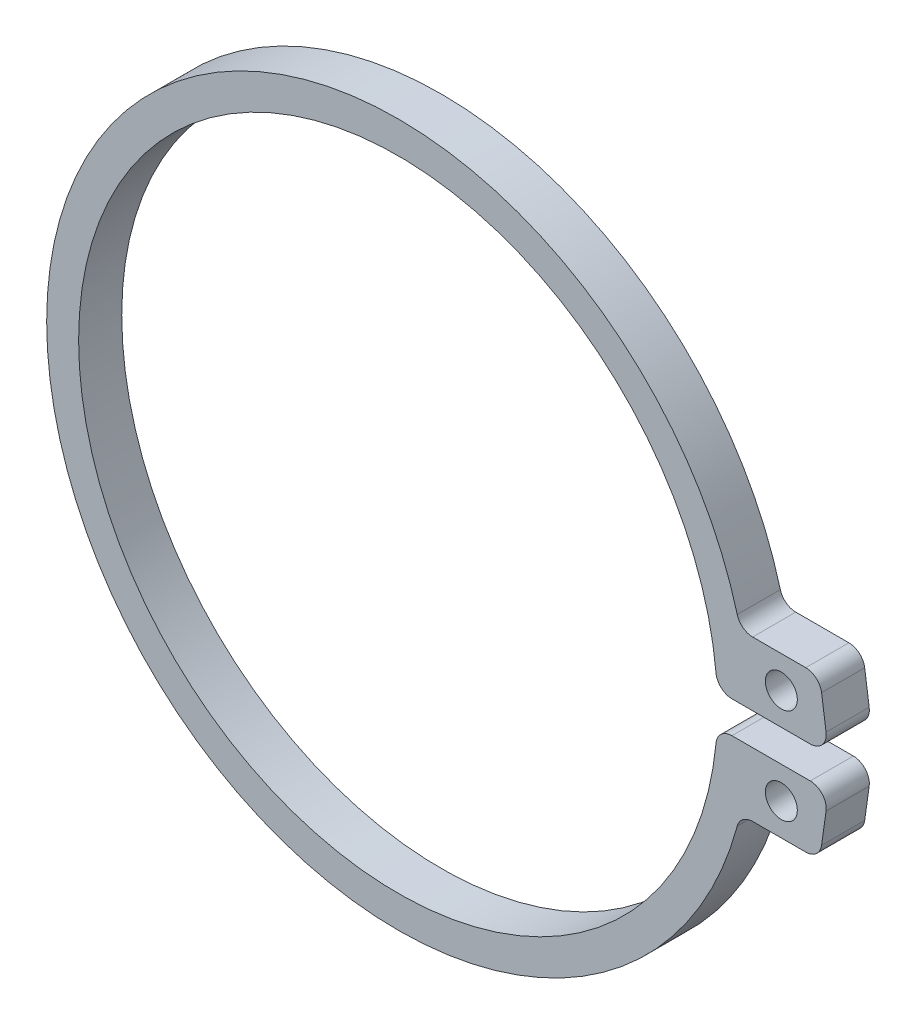
ISO-10303-21;
HEADER;
FILE_DESCRIPTION(('STEP AP214'),'2;1');
FILE_NAME('part.step','',(''),(''),'','','');
FILE_SCHEMA(('AUTOMOTIVE_DESIGN { 1 0 10303 214 1 1 1 1 }'));
ENDSEC;
DATA;
#1=APPLICATION_CONTEXT('core data for automotive mechanical design processes');
#2=APPLICATION_PROTOCOL_DEFINITION('international standard','automotive_design',2000,#1);
#3=PRODUCT_CONTEXT('',#1,'mechanical');
#4=PRODUCT('Part','Part','',(#3));
#5=PRODUCT_RELATED_PRODUCT_CATEGORY('part','',(#4));
#6=PRODUCT_DEFINITION_FORMATION('','',#4);
#7=PRODUCT_DEFINITION_CONTEXT('part definition',#1,'design');
#8=PRODUCT_DEFINITION('design','',#6,#7);
#9=PRODUCT_DEFINITION_SHAPE('','',#8);
#10=(LENGTH_UNIT() NAMED_UNIT(*) SI_UNIT(.MILLI.,.METRE.));
#11=(NAMED_UNIT(*) PLANE_ANGLE_UNIT() SI_UNIT($,.RADIAN.));
#12=(NAMED_UNIT(*) SI_UNIT($,.STERADIAN.) SOLID_ANGLE_UNIT());
#13=UNCERTAINTY_MEASURE_WITH_UNIT(LENGTH_MEASURE(1.E-05),#10,'distance_accuracy_value','');
#14=(GEOMETRIC_REPRESENTATION_CONTEXT(3) GLOBAL_UNCERTAINTY_ASSIGNED_CONTEXT((#13)) GLOBAL_UNIT_ASSIGNED_CONTEXT((#10,
#11,#12)) REPRESENTATION_CONTEXT('',''));
#15=CARTESIAN_POINT('',(0.,0.,0.));
#16=DIRECTION('',(0.,0.,1.));
#17=DIRECTION('',(1.,0.,0.));
#18=AXIS2_PLACEMENT_3D('',#15,#16,#17);
#19=CARTESIAN_POINT('',(12.9048659656292,1.,0.675));
#20=DIRECTION('',(0.,0.,-1.));
#21=DIRECTION('',(-1.,0.,0.));
#22=AXIS2_PLACEMENT_3D('',#19,#20,#21);
#23=PLANE('',#22);
#24=CARTESIAN_POINT('',(12.9048659656292,1.,0.675));
#25=DIRECTION('',(0.,0.,1.));
#26=DIRECTION('',(-1.,0.,0.));
#27=AXIS2_PLACEMENT_3D('',#24,#25,#26);
#28=CIRCLE('',#27,0.499999999999999);
#29=CARTESIAN_POINT('',(12.9048659656292,0.500000000000003,0.675));
#30=VERTEX_POINT('',#29);
#31=CARTESIAN_POINT('',(13.4,1.06958655048004,0.675));
#32=VERTEX_POINT('',#31);
#33=EDGE_CURVE('E219',#30,#32,#28,.T.);
#34=ORIENTED_EDGE('',*,*,#33,.T.);
#35=DIRECTION('',(-0.139173100960067,0.99026806874157,0.));
#36=VECTOR('',#35,1.);
#37=CARTESIAN_POINT('',(13.4,1.06958655048004,0.675));
#38=LINE('',#37,#36);
#39=CARTESIAN_POINT('',(13.2594591652976,2.06958655048004,0.675));
#40=VERTEX_POINT('',#39);
#41=EDGE_CURVE('E127',#32,#40,#38,.T.);
#42=ORIENTED_EDGE('',*,*,#41,.T.);
#43=CARTESIAN_POINT('',(12.7643251309268,2.,0.675));
#44=DIRECTION('',(0.,0.,1.));
#45=DIRECTION('',(1.,0.,0.));
#46=AXIS2_PLACEMENT_3D('',#43,#44,#45);
#47=CIRCLE('',#46,0.5);
#48=CARTESIAN_POINT('',(12.7643251309268,2.5,0.675));
#49=VERTEX_POINT('',#48);
#50=EDGE_CURVE('E258',#40,#49,#47,.T.);
#51=ORIENTED_EDGE('',*,*,#50,.T.);
#52=DIRECTION('',(-1.,0.,0.));
#53=VECTOR('',#52,1.);
#54=CARTESIAN_POINT('',(11.1018016555873,2.5,0.675));
#55=LINE('',#54,#53);
#56=CARTESIAN_POINT('',(11.1018016555873,2.5,0.675));
#57=VERTEX_POINT('',#56);
#58=EDGE_CURVE('E277',#49,#57,#55,.T.);
#59=ORIENTED_EDGE('',*,*,#58,.T.);
#60=CARTESIAN_POINT('',(11.1018016555873,3.,0.675));
#61=DIRECTION('',(0.,0.,-1.));
#62=DIRECTION('',(-1.,0.,0.));
#63=AXIS2_PLACEMENT_3D('',#60,#61,#62);
#64=CIRCLE('',#63,0.500000000000001);
#65=CARTESIAN_POINT('',(10.6191146270835,2.86956521739131,0.675));
#66=VERTEX_POINT('',#65);
#67=EDGE_CURVE('E274',#57,#66,#64,.T.);
#68=ORIENTED_EDGE('',*,*,#67,.T.);
#69=CARTESIAN_POINT('',(0.,0.,0.675));
#70=DIRECTION('',(0.,0.,1.));
#71=DIRECTION('',(1.,0.,0.));
#72=AXIS2_PLACEMENT_3D('',#69,#70,#71);
#73=CIRCLE('',#72,11.);
#74=CARTESIAN_POINT('',(10.6191146270835,-2.86956521739131,0.675));
#75=VERTEX_POINT('',#74);
#76=EDGE_CURVE('E276',#66,#75,#73,.T.);
#77=ORIENTED_EDGE('',*,*,#76,.T.);
#78=CARTESIAN_POINT('',(11.1018016555873,-3.,0.675));
#79=DIRECTION('',(0.,0.,-1.));
#80=DIRECTION('',(1.,0.,0.));
#81=AXIS2_PLACEMENT_3D('',#78,#79,#80);
#82=CIRCLE('',#81,0.5);
#83=CARTESIAN_POINT('',(11.1018016555873,-2.5,0.675));
#84=VERTEX_POINT('',#83);
#85=EDGE_CURVE('E279',#75,#84,#82,.T.);
#86=ORIENTED_EDGE('',*,*,#85,.T.);
#87=DIRECTION('',(1.,0.,0.));
#88=VECTOR('',#87,1.);
#89=CARTESIAN_POINT('',(11.1018016555873,-2.5,0.675));
#90=LINE('',#89,#88);
#91=CARTESIAN_POINT('',(12.7643251309268,-2.5,0.675));
#92=VERTEX_POINT('',#91);
#93=EDGE_CURVE('E285',#84,#92,#90,.T.);
#94=ORIENTED_EDGE('',*,*,#93,.T.);
#95=CARTESIAN_POINT('',(12.7643251309268,-2.,0.675));
#96=DIRECTION('',(0.,0.,1.));
#97=DIRECTION('',(1.,0.,0.));
#98=AXIS2_PLACEMENT_3D('',#95,#96,#97);
#99=CIRCLE('',#98,0.5);
#100=CARTESIAN_POINT('',(13.2594591652976,-2.06958655048003,0.675));
#101=VERTEX_POINT('',#100);
#102=EDGE_CURVE('E287',#92,#101,#99,.T.);
#103=ORIENTED_EDGE('',*,*,#102,.T.);
#104=DIRECTION('',(0.139173100960067,0.99026806874157,0.));
#105=VECTOR('',#104,1.);
#106=CARTESIAN_POINT('',(13.4,-1.06958655048003,0.675));
#107=LINE('',#106,#105);
#108=CARTESIAN_POINT('',(13.4,-1.06958655048003,0.675));
#109=VERTEX_POINT('',#108);
#110=EDGE_CURVE('E289',#101,#109,#107,.T.);
#111=ORIENTED_EDGE('',*,*,#110,.T.);
#112=CARTESIAN_POINT('',(12.9048659656292,-0.999999999999999,0.675));
#113=DIRECTION('',(0.,0.,1.));
#114=DIRECTION('',(1.,0.,0.));
#115=AXIS2_PLACEMENT_3D('',#112,#113,#114);
#116=CIRCLE('',#115,0.499999999999999);
#117=CARTESIAN_POINT('',(12.9048659656292,-0.5,0.675));
#118=VERTEX_POINT('',#117);
#119=EDGE_CURVE('E291',#109,#118,#116,.T.);
#120=ORIENTED_EDGE('',*,*,#119,.T.);
#121=DIRECTION('',(-1.,0.,0.));
#122=VECTOR('',#121,1.);
#123=CARTESIAN_POINT('',(10.4522724801834,-0.499999999999997,0.675));
#124=LINE('',#123,#122);
#125=CARTESIAN_POINT('',(10.4522724801834,-0.499999999999997,0.675));
#126=VERTEX_POINT('',#125);
#127=EDGE_CURVE('E293',#118,#126,#124,.T.);
#128=ORIENTED_EDGE('',*,*,#127,.T.);
#129=CARTESIAN_POINT('',(10.4522724801834,-0.999999999999997,0.675));
#130=DIRECTION('',(0.,0.,1.));
#131=DIRECTION('',(1.,0.,0.));
#132=AXIS2_PLACEMENT_3D('',#129,#130,#131);
#133=CIRCLE('',#132,0.5);
#134=CARTESIAN_POINT('',(9.95454521922232,-0.95238095238095,0.675));
#135=VERTEX_POINT('',#134);
#136=EDGE_CURVE('E170',#126,#135,#133,.T.);
#137=ORIENTED_EDGE('',*,*,#136,.T.);
#138=CARTESIAN_POINT('',(0.,0.,0.675));
#139=DIRECTION('',(0.,0.,-1.));
#140=DIRECTION('',(1.,0.,0.));
#141=AXIS2_PLACEMENT_3D('',#138,#139,#140);
#142=CIRCLE('',#141,10.);
#143=CARTESIAN_POINT('',(9.95454521922232,0.952380952380954,0.675));
#144=VERTEX_POINT('',#143);
#145=EDGE_CURVE('E164',#135,#144,#142,.T.);
#146=ORIENTED_EDGE('',*,*,#145,.T.);
#147=CARTESIAN_POINT('',(10.4522724801834,1.,0.675));
#148=DIRECTION('',(0.,0.,1.));
#149=DIRECTION('',(1.,0.,0.));
#150=AXIS2_PLACEMENT_3D('',#147,#148,#149);
#151=CIRCLE('',#150,0.5);
#152=CARTESIAN_POINT('',(10.4522724801834,0.500000000000001,0.675));
#153=VERTEX_POINT('',#152);
#154=EDGE_CURVE('E168',#144,#153,#151,.T.);
#155=ORIENTED_EDGE('',*,*,#154,.T.);
#156=DIRECTION('',(1.,0.,0.));
#157=VECTOR('',#156,1.);
#158=CARTESIAN_POINT('',(12.9048659656292,0.500000000000003,0.675));
#159=LINE('',#158,#157);
#160=EDGE_CURVE('E60',#153,#30,#159,.T.);
#161=ORIENTED_EDGE('',*,*,#160,.T.);
#162=EDGE_LOOP('',(#34,#42,#51,#59,#68,#77,#86,#94,#103,#111,#120,#128,#137,#146,#155,#161));
#163=FACE_BOUND('',#162,.T.);
#164=CARTESIAN_POINT('',(12.,-1.5,0.675));
#165=DIRECTION('',(0.,0.,1.));
#166=DIRECTION('',(1.,0.,0.));
#167=AXIS2_PLACEMENT_3D('',#164,#165,#166);
#168=CIRCLE('',#167,0.5);
#169=CARTESIAN_POINT('',(12.5,-1.5,0.675));
#170=VERTEX_POINT('',#169);
#171=EDGE_CURVE('E192',#170,#170,#168,.T.);
#172=ORIENTED_EDGE('',*,*,#171,.F.);
#173=EDGE_LOOP('',(#172));
#174=FACE_BOUND('',#173,.T.);
#175=CARTESIAN_POINT('',(12.,1.5,0.675));
#176=DIRECTION('',(0.,0.,1.));
#177=DIRECTION('',(-1.,0.,0.));
#178=AXIS2_PLACEMENT_3D('',#175,#176,#177);
#179=CIRCLE('',#178,0.5);
#180=CARTESIAN_POINT('',(11.5,1.5,0.675));
#181=VERTEX_POINT('',#180);
#182=EDGE_CURVE('E334',#181,#181,#179,.T.);
#183=ORIENTED_EDGE('',*,*,#182,.F.);
#184=EDGE_LOOP('',(#183));
#185=FACE_BOUND('',#184,.T.);
#186=ADVANCED_FACE('F43',(#163,#174,#185),#23,.F.);
#187=CARTESIAN_POINT('',(12.9048659656292,1.,-0.675));
#188=DIRECTION('',(0.,0.,-1.));
#189=DIRECTION('',(-1.,0.,0.));
#190=AXIS2_PLACEMENT_3D('',#187,#188,#189);
#191=PLANE('',#190);
#192=CARTESIAN_POINT('',(12.,-1.5,-0.675));
#193=DIRECTION('',(0.,0.,1.));
#194=DIRECTION('',(1.,0.,0.));
#195=AXIS2_PLACEMENT_3D('',#192,#193,#194);
#196=CIRCLE('',#195,0.5);
#197=CARTESIAN_POINT('',(12.5,-1.5,-0.675));
#198=VERTEX_POINT('',#197);
#199=EDGE_CURVE('E339',#198,#198,#196,.T.);
#200=ORIENTED_EDGE('',*,*,#199,.T.);
#201=EDGE_LOOP('',(#200));
#202=FACE_BOUND('',#201,.T.);
#203=CARTESIAN_POINT('',(12.9048659656292,1.,-0.675));
#204=DIRECTION('',(0.,0.,1.));
#205=DIRECTION('',(-1.,0.,0.));
#206=AXIS2_PLACEMENT_3D('',#203,#204,#205);
#207=CIRCLE('',#206,0.499999999999999);
#208=CARTESIAN_POINT('',(12.9048659656292,0.500000000000003,-0.675));
#209=VERTEX_POINT('',#208);
#210=CARTESIAN_POINT('',(13.4,1.06958655048004,-0.675));
#211=VERTEX_POINT('',#210);
#212=EDGE_CURVE('E188',#209,#211,#207,.T.);
#213=ORIENTED_EDGE('',*,*,#212,.F.);
#214=DIRECTION('',(1.,0.,0.));
#215=VECTOR('',#214,1.);
#216=CARTESIAN_POINT('',(12.9048659656292,0.500000000000003,-0.675));
#217=LINE('',#216,#215);
#218=CARTESIAN_POINT('',(10.4522724801834,0.500000000000001,-0.675));
#219=VERTEX_POINT('',#218);
#220=EDGE_CURVE('E119',#219,#209,#217,.T.);
#221=ORIENTED_EDGE('',*,*,#220,.F.);
#222=CARTESIAN_POINT('',(10.4522724801834,1.,-0.675));
#223=DIRECTION('',(0.,0.,1.));
#224=DIRECTION('',(1.,0.,0.));
#225=AXIS2_PLACEMENT_3D('',#222,#223,#224);
#226=CIRCLE('',#225,0.5);
#227=CARTESIAN_POINT('',(9.95454521922232,0.952380952380954,-0.675));
#228=VERTEX_POINT('',#227);
#229=EDGE_CURVE('E113',#228,#219,#226,.T.);
#230=ORIENTED_EDGE('',*,*,#229,.F.);
#231=CARTESIAN_POINT('',(0.,0.,-0.675));
#232=DIRECTION('',(0.,0.,-1.));
#233=DIRECTION('',(1.,0.,0.));
#234=AXIS2_PLACEMENT_3D('',#231,#232,#233);
#235=CIRCLE('',#234,10.);
#236=CARTESIAN_POINT('',(9.95454521922232,-0.95238095238095,-0.675));
#237=VERTEX_POINT('',#236);
#238=EDGE_CURVE('E178',#237,#228,#235,.T.);
#239=ORIENTED_EDGE('',*,*,#238,.F.);
#240=CARTESIAN_POINT('',(10.4522724801834,-0.999999999999997,-0.675));
#241=DIRECTION('',(0.,0.,1.));
#242=DIRECTION('',(1.,0.,0.));
#243=AXIS2_PLACEMENT_3D('',#240,#241,#242);
#244=CIRCLE('',#243,0.5);
#245=CARTESIAN_POINT('',(10.4522724801834,-0.499999999999997,-0.675));
#246=VERTEX_POINT('',#245);
#247=EDGE_CURVE('E214',#246,#237,#244,.T.);
#248=ORIENTED_EDGE('',*,*,#247,.F.);
#249=DIRECTION('',(-1.,0.,0.));
#250=VECTOR('',#249,1.);
#251=CARTESIAN_POINT('',(10.4522724801834,-0.499999999999997,-0.675));
#252=LINE('',#251,#250);
#253=CARTESIAN_POINT('',(12.9048659656292,-0.5,-0.675));
#254=VERTEX_POINT('',#253);
#255=EDGE_CURVE('E212',#254,#246,#252,.T.);
#256=ORIENTED_EDGE('',*,*,#255,.F.);
#257=CARTESIAN_POINT('',(12.9048659656292,-0.999999999999999,-0.675));
#258=DIRECTION('',(0.,0.,1.));
#259=DIRECTION('',(1.,0.,0.));
#260=AXIS2_PLACEMENT_3D('',#257,#258,#259);
#261=CIRCLE('',#260,0.499999999999999);
#262=CARTESIAN_POINT('',(13.4,-1.06958655048003,-0.675));
#263=VERTEX_POINT('',#262);
#264=EDGE_CURVE('E210',#263,#254,#261,.T.);
#265=ORIENTED_EDGE('',*,*,#264,.F.);
#266=DIRECTION('',(0.139173100960067,0.99026806874157,0.));
#267=VECTOR('',#266,1.);
#268=CARTESIAN_POINT('',(13.4,-1.06958655048003,-0.675));
#269=LINE('',#268,#267);
#270=CARTESIAN_POINT('',(13.2594591652976,-2.06958655048003,-0.675));
#271=VERTEX_POINT('',#270);
#272=EDGE_CURVE('E208',#271,#263,#269,.T.);
#273=ORIENTED_EDGE('',*,*,#272,.F.);
#274=CARTESIAN_POINT('',(12.7643251309268,-2.,-0.675));
#275=DIRECTION('',(0.,0.,1.));
#276=DIRECTION('',(1.,0.,0.));
#277=AXIS2_PLACEMENT_3D('',#274,#275,#276);
#278=CIRCLE('',#277,0.5);
#279=CARTESIAN_POINT('',(12.7643251309268,-2.5,-0.675));
#280=VERTEX_POINT('',#279);
#281=EDGE_CURVE('E206',#280,#271,#278,.T.);
#282=ORIENTED_EDGE('',*,*,#281,.F.);
#283=DIRECTION('',(1.,0.,0.));
#284=VECTOR('',#283,1.);
#285=CARTESIAN_POINT('',(11.1018016555873,-2.5,-0.675));
#286=LINE('',#285,#284);
#287=CARTESIAN_POINT('',(11.1018016555873,-2.5,-0.675));
#288=VERTEX_POINT('',#287);
#289=EDGE_CURVE('E204',#288,#280,#286,.T.);
#290=ORIENTED_EDGE('',*,*,#289,.F.);
#291=CARTESIAN_POINT('',(11.1018016555873,-3.,-0.675));
#292=DIRECTION('',(0.,0.,-1.));
#293=DIRECTION('',(1.,0.,0.));
#294=AXIS2_PLACEMENT_3D('',#291,#292,#293);
#295=CIRCLE('',#294,0.5);
#296=CARTESIAN_POINT('',(10.6191146270835,-2.86956521739131,-0.675));
#297=VERTEX_POINT('',#296);
#298=EDGE_CURVE('E202',#297,#288,#295,.T.);
#299=ORIENTED_EDGE('',*,*,#298,.F.);
#300=CARTESIAN_POINT('',(0.,0.,-0.675));
#301=DIRECTION('',(0.,0.,1.));
#302=DIRECTION('',(1.,0.,0.));
#303=AXIS2_PLACEMENT_3D('',#300,#301,#302);
#304=CIRCLE('',#303,11.);
#305=CARTESIAN_POINT('',(10.6191146270835,2.86956521739131,-0.675));
#306=VERTEX_POINT('',#305);
#307=EDGE_CURVE('E200',#306,#297,#304,.T.);
#308=ORIENTED_EDGE('',*,*,#307,.F.);
#309=CARTESIAN_POINT('',(11.1018016555873,3.,-0.675));
#310=DIRECTION('',(0.,0.,-1.));
#311=DIRECTION('',(-1.,0.,0.));
#312=AXIS2_PLACEMENT_3D('',#309,#310,#311);
#313=CIRCLE('',#312,0.500000000000001);
#314=CARTESIAN_POINT('',(11.1018016555873,2.5,-0.675));
#315=VERTEX_POINT('',#314);
#316=EDGE_CURVE('E198',#315,#306,#313,.T.);
#317=ORIENTED_EDGE('',*,*,#316,.F.);
#318=DIRECTION('',(-1.,0.,0.));
#319=VECTOR('',#318,1.);
#320=CARTESIAN_POINT('',(11.1018016555873,2.5,-0.675));
#321=LINE('',#320,#319);
#322=CARTESIAN_POINT('',(12.7643251309268,2.5,-0.675));
#323=VERTEX_POINT('',#322);
#324=EDGE_CURVE('E196',#323,#315,#321,.T.);
#325=ORIENTED_EDGE('',*,*,#324,.F.);
#326=CARTESIAN_POINT('',(12.7643251309268,2.,-0.675));
#327=DIRECTION('',(0.,0.,1.));
#328=DIRECTION('',(1.,0.,0.));
#329=AXIS2_PLACEMENT_3D('',#326,#327,#328);
#330=CIRCLE('',#329,0.5);
#331=CARTESIAN_POINT('',(13.2594591652976,2.06958655048004,-0.675));
#332=VERTEX_POINT('',#331);
#333=EDGE_CURVE('E194',#332,#323,#330,.T.);
#334=ORIENTED_EDGE('',*,*,#333,.F.);
#335=DIRECTION('',(-0.139173100960067,0.99026806874157,0.));
#336=VECTOR('',#335,1.);
#337=CARTESIAN_POINT('',(13.4,1.06958655048004,-0.675));
#338=LINE('',#337,#336);
#339=EDGE_CURVE('E191',#211,#332,#338,.T.);
#340=ORIENTED_EDGE('',*,*,#339,.F.);
#341=EDGE_LOOP('',(#213,#221,#230,#239,#248,#256,#265,#273,#282,#290,#299,#308,#317,#325,#334,#340));
#342=FACE_BOUND('',#341,.T.);
#343=CARTESIAN_POINT('',(12.,1.5,-0.675));
#344=DIRECTION('',(0.,0.,1.));
#345=DIRECTION('',(-1.,0.,0.));
#346=AXIS2_PLACEMENT_3D('',#343,#344,#345);
#347=CIRCLE('',#346,0.5);
#348=CARTESIAN_POINT('',(11.5,1.5,-0.675));
#349=VERTEX_POINT('',#348);
#350=EDGE_CURVE('E337',#349,#349,#347,.T.);
#351=ORIENTED_EDGE('',*,*,#350,.T.);
#352=EDGE_LOOP('',(#351));
#353=FACE_BOUND('',#352,.T.);
#354=ADVANCED_FACE('F262',(#202,#342,#353),#191,.T.);
#355=CARTESIAN_POINT('',(12.9048659656292,1.,0.675));
#356=DIRECTION('',(0.,0.,-1.));
#357=DIRECTION('',(-1.,0.,0.));
#358=AXIS2_PLACEMENT_3D('',#355,#356,#357);
#359=CYLINDRICAL_SURFACE('',#358,0.499999999999999);
#360=ORIENTED_EDGE('',*,*,#212,.T.);
#361=DIRECTION('',(0.,0.,-1.));
#362=VECTOR('',#361,1.);
#363=CARTESIAN_POINT('',(13.4,1.06958655048004,0.675));
#364=LINE('',#363,#362);
#365=EDGE_CURVE('E11',#32,#211,#364,.T.);
#366=ORIENTED_EDGE('',*,*,#365,.F.);
#367=ORIENTED_EDGE('',*,*,#33,.F.);
#368=DIRECTION('',(0.,0.,-1.));
#369=VECTOR('',#368,1.);
#370=CARTESIAN_POINT('',(12.9048659656292,0.500000000000003,0.675));
#371=LINE('',#370,#369);
#372=EDGE_CURVE('E184',#30,#209,#371,.T.);
#373=ORIENTED_EDGE('',*,*,#372,.T.);
#374=EDGE_LOOP('',(#360,#366,#367,#373));
#375=FACE_BOUND('',#374,.T.);
#376=ADVANCED_FACE('F45',(#375),#359,.T.);
#377=CARTESIAN_POINT('',(13.4,1.06958655048004,0.675));
#378=DIRECTION('',(-0.99026806874157,-0.139173100960067,0.));
#379=DIRECTION('',(0.139173100960067,-0.99026806874157,0.));
#380=AXIS2_PLACEMENT_3D('',#377,#378,#379);
#381=PLANE('',#380);
#382=ORIENTED_EDGE('',*,*,#339,.T.);
#383=DIRECTION('',(0.,0.,-1.));
#384=VECTOR('',#383,1.);
#385=CARTESIAN_POINT('',(13.2594591652976,2.06958655048004,0.675));
#386=LINE('',#385,#384);
#387=EDGE_CURVE('E52',#40,#332,#386,.T.);
#388=ORIENTED_EDGE('',*,*,#387,.F.);
#389=ORIENTED_EDGE('',*,*,#41,.F.);
#390=ORIENTED_EDGE('',*,*,#365,.T.);
#391=EDGE_LOOP('',(#382,#388,#389,#390));
#392=FACE_BOUND('',#391,.T.);
#393=ADVANCED_FACE('F474',(#392),#381,.F.);
#394=CARTESIAN_POINT('',(12.7643251309268,2.,0.675));
#395=DIRECTION('',(0.,0.,-1.));
#396=DIRECTION('',(-1.,0.,0.));
#397=AXIS2_PLACEMENT_3D('',#394,#395,#396);
#398=CYLINDRICAL_SURFACE('',#397,0.5);
#399=ORIENTED_EDGE('',*,*,#333,.T.);
#400=DIRECTION('',(0.,0.,-1.));
#401=VECTOR('',#400,1.);
#402=CARTESIAN_POINT('',(12.7643251309268,2.5,0.675));
#403=LINE('',#402,#401);
#404=EDGE_CURVE('E250',#49,#323,#403,.T.);
#405=ORIENTED_EDGE('',*,*,#404,.F.);
#406=ORIENTED_EDGE('',*,*,#50,.F.);
#407=ORIENTED_EDGE('',*,*,#387,.T.);
#408=EDGE_LOOP('',(#399,#405,#406,#407));
#409=FACE_BOUND('',#408,.T.);
#410=ADVANCED_FACE('F256',(#409),#398,.T.);
#411=CARTESIAN_POINT('',(11.1018016555873,2.5,0.675));
#412=DIRECTION('',(0.,-1.,0.));
#413=DIRECTION('',(1.,0.,0.));
#414=AXIS2_PLACEMENT_3D('',#411,#412,#413);
#415=PLANE('',#414);
#416=ORIENTED_EDGE('',*,*,#324,.T.);
#417=DIRECTION('',(0.,0.,-1.));
#418=VECTOR('',#417,1.);
#419=CARTESIAN_POINT('',(11.1018016555873,2.5,0.675));
#420=LINE('',#419,#418);
#421=EDGE_CURVE('E247',#57,#315,#420,.T.);
#422=ORIENTED_EDGE('',*,*,#421,.F.);
#423=ORIENTED_EDGE('',*,*,#58,.F.);
#424=ORIENTED_EDGE('',*,*,#404,.T.);
#425=EDGE_LOOP('',(#416,#422,#423,#424));
#426=FACE_BOUND('',#425,.T.);
#427=ADVANCED_FACE('F268',(#426),#415,.F.);
#428=CARTESIAN_POINT('',(11.1018016555873,3.,0.675));
#429=DIRECTION('',(0.,0.,-1.));
#430=DIRECTION('',(-1.,0.,0.));
#431=AXIS2_PLACEMENT_3D('',#428,#429,#430);
#432=CYLINDRICAL_SURFACE('',#431,0.500000000000001);
#433=ORIENTED_EDGE('',*,*,#316,.T.);
#434=DIRECTION('',(0.,0.,-1.));
#435=VECTOR('',#434,1.);
#436=CARTESIAN_POINT('',(10.6191146270835,2.86956521739131,0.675));
#437=LINE('',#436,#435);
#438=EDGE_CURVE('E244',#66,#306,#437,.T.);
#439=ORIENTED_EDGE('',*,*,#438,.F.);
#440=ORIENTED_EDGE('',*,*,#67,.F.);
#441=ORIENTED_EDGE('',*,*,#421,.T.);
#442=EDGE_LOOP('',(#433,#439,#440,#441));
#443=FACE_BOUND('',#442,.T.);
#444=ADVANCED_FACE('F272',(#443),#432,.F.);
#445=CARTESIAN_POINT('',(0.,0.,0.675));
#446=DIRECTION('',(0.,0.,-1.));
#447=DIRECTION('',(-1.,0.,0.));
#448=AXIS2_PLACEMENT_3D('',#445,#446,#447);
#449=CYLINDRICAL_SURFACE('',#448,11.);
#450=ORIENTED_EDGE('',*,*,#307,.T.);
#451=DIRECTION('',(0.,0.,-1.));
#452=VECTOR('',#451,1.);
#453=CARTESIAN_POINT('',(10.6191146270835,-2.86956521739131,0.675));
#454=LINE('',#453,#452);
#455=EDGE_CURVE('E241',#75,#297,#454,.T.);
#456=ORIENTED_EDGE('',*,*,#455,.F.);
#457=ORIENTED_EDGE('',*,*,#76,.F.);
#458=ORIENTED_EDGE('',*,*,#438,.T.);
#459=EDGE_LOOP('',(#450,#456,#457,#458));
#460=FACE_BOUND('',#459,.T.);
#461=ADVANCED_FACE('F439',(#460),#449,.T.);
#462=CARTESIAN_POINT('',(11.1018016555873,-3.,0.675));
#463=DIRECTION('',(0.,0.,-1.));
#464=DIRECTION('',(-1.,0.,0.));
#465=AXIS2_PLACEMENT_3D('',#462,#463,#464);
#466=CYLINDRICAL_SURFACE('',#465,0.5);
#467=ORIENTED_EDGE('',*,*,#298,.T.);
#468=DIRECTION('',(0.,0.,-1.));
#469=VECTOR('',#468,1.);
#470=CARTESIAN_POINT('',(11.1018016555873,-2.5,0.675));
#471=LINE('',#470,#469);
#472=EDGE_CURVE('E238',#84,#288,#471,.T.);
#473=ORIENTED_EDGE('',*,*,#472,.F.);
#474=ORIENTED_EDGE('',*,*,#85,.F.);
#475=ORIENTED_EDGE('',*,*,#455,.T.);
#476=EDGE_LOOP('',(#467,#473,#474,#475));
#477=FACE_BOUND('',#476,.T.);
#478=ADVANCED_FACE('F429',(#477),#466,.F.);
#479=CARTESIAN_POINT('',(11.1018016555873,-2.5,0.675));
#480=DIRECTION('',(0.,1.,0.));
#481=DIRECTION('',(0.,0.,1.));
#482=AXIS2_PLACEMENT_3D('',#479,#480,#481);
#483=PLANE('',#482);
#484=ORIENTED_EDGE('',*,*,#289,.T.);
#485=DIRECTION('',(0.,0.,-1.));
#486=VECTOR('',#485,1.);
#487=CARTESIAN_POINT('',(12.7643251309268,-2.5,0.675));
#488=LINE('',#487,#486);
#489=EDGE_CURVE('E235',#92,#280,#488,.T.);
#490=ORIENTED_EDGE('',*,*,#489,.F.);
#491=ORIENTED_EDGE('',*,*,#93,.F.);
#492=ORIENTED_EDGE('',*,*,#472,.T.);
#493=EDGE_LOOP('',(#484,#490,#491,#492));
#494=FACE_BOUND('',#493,.T.);
#495=ADVANCED_FACE('F419',(#494),#483,.F.);
#496=CARTESIAN_POINT('',(12.7643251309268,-2.,0.675));
#497=DIRECTION('',(0.,0.,-1.));
#498=DIRECTION('',(-1.,0.,0.));
#499=AXIS2_PLACEMENT_3D('',#496,#497,#498);
#500=CYLINDRICAL_SURFACE('',#499,0.5);
#501=ORIENTED_EDGE('',*,*,#281,.T.);
#502=DIRECTION('',(0.,0.,-1.));
#503=VECTOR('',#502,1.);
#504=CARTESIAN_POINT('',(13.2594591652976,-2.06958655048003,0.675));
#505=LINE('',#504,#503);
#506=EDGE_CURVE('E232',#101,#271,#505,.T.);
#507=ORIENTED_EDGE('',*,*,#506,.F.);
#508=ORIENTED_EDGE('',*,*,#102,.F.);
#509=ORIENTED_EDGE('',*,*,#489,.T.);
#510=EDGE_LOOP('',(#501,#507,#508,#509));
#511=FACE_BOUND('',#510,.T.);
#512=ADVANCED_FACE('F409',(#511),#500,.T.);
#513=CARTESIAN_POINT('',(13.4,-1.06958655048003,0.675));
#514=DIRECTION('',(-0.99026806874157,0.139173100960067,0.));
#515=DIRECTION('',(-0.139173100960067,-0.99026806874157,0.));
#516=AXIS2_PLACEMENT_3D('',#513,#514,#515);
#517=PLANE('',#516);
#518=ORIENTED_EDGE('',*,*,#272,.T.);
#519=DIRECTION('',(0.,0.,-1.));
#520=VECTOR('',#519,1.);
#521=CARTESIAN_POINT('',(13.4,-1.06958655048003,0.675));
#522=LINE('',#521,#520);
#523=EDGE_CURVE('E229',#109,#263,#522,.T.);
#524=ORIENTED_EDGE('',*,*,#523,.F.);
#525=ORIENTED_EDGE('',*,*,#110,.F.);
#526=ORIENTED_EDGE('',*,*,#506,.T.);
#527=EDGE_LOOP('',(#518,#524,#525,#526));
#528=FACE_BOUND('',#527,.T.);
#529=ADVANCED_FACE('F399',(#528),#517,.F.);
#530=CARTESIAN_POINT('',(12.9048659656292,-0.999999999999999,0.675));
#531=DIRECTION('',(0.,0.,-1.));
#532=DIRECTION('',(-1.,0.,0.));
#533=AXIS2_PLACEMENT_3D('',#530,#531,#532);
#534=CYLINDRICAL_SURFACE('',#533,0.499999999999999);
#535=ORIENTED_EDGE('',*,*,#264,.T.);
#536=DIRECTION('',(0.,0.,-1.));
#537=VECTOR('',#536,1.);
#538=CARTESIAN_POINT('',(12.9048659656292,-0.5,0.675));
#539=LINE('',#538,#537);
#540=EDGE_CURVE('E226',#118,#254,#539,.T.);
#541=ORIENTED_EDGE('',*,*,#540,.F.);
#542=ORIENTED_EDGE('',*,*,#119,.F.);
#543=ORIENTED_EDGE('',*,*,#523,.T.);
#544=EDGE_LOOP('',(#535,#541,#542,#543));
#545=FACE_BOUND('',#544,.T.);
#546=ADVANCED_FACE('F390',(#545),#534,.T.);
#547=CARTESIAN_POINT('',(10.4522724801834,-0.499999999999997,0.675));
#548=DIRECTION('',(0.,-1.,0.));
#549=DIRECTION('',(1.,0.,0.));
#550=AXIS2_PLACEMENT_3D('',#547,#548,#549);
#551=PLANE('',#550);
#552=ORIENTED_EDGE('',*,*,#255,.T.);
#553=DIRECTION('',(0.,0.,-1.));
#554=VECTOR('',#553,1.);
#555=CARTESIAN_POINT('',(10.4522724801834,-0.499999999999997,0.675));
#556=LINE('',#555,#554);
#557=EDGE_CURVE('E223',#126,#246,#556,.T.);
#558=ORIENTED_EDGE('',*,*,#557,.F.);
#559=ORIENTED_EDGE('',*,*,#127,.F.);
#560=ORIENTED_EDGE('',*,*,#540,.T.);
#561=EDGE_LOOP('',(#552,#558,#559,#560));
#562=FACE_BOUND('',#561,.T.);
#563=ADVANCED_FACE('F299',(#562),#551,.F.);
#564=CARTESIAN_POINT('',(10.4522724801834,-0.999999999999997,0.675));
#565=DIRECTION('',(0.,0.,-1.));
#566=DIRECTION('',(-1.,0.,0.));
#567=AXIS2_PLACEMENT_3D('',#564,#565,#566);
#568=CYLINDRICAL_SURFACE('',#567,0.5);
#569=ORIENTED_EDGE('',*,*,#247,.T.);
#570=DIRECTION('',(0.,0.,-1.));
#571=VECTOR('',#570,1.);
#572=CARTESIAN_POINT('',(9.95454521922232,-0.95238095238095,0.675));
#573=LINE('',#572,#571);
#574=EDGE_CURVE('E179',#135,#237,#573,.T.);
#575=ORIENTED_EDGE('',*,*,#574,.F.);
#576=ORIENTED_EDGE('',*,*,#136,.F.);
#577=ORIENTED_EDGE('',*,*,#557,.T.);
#578=EDGE_LOOP('',(#569,#575,#576,#577));
#579=FACE_BOUND('',#578,.T.);
#580=ADVANCED_FACE('F303',(#579),#568,.T.);
#581=CARTESIAN_POINT('',(0.,0.,0.675));
#582=DIRECTION('',(0.,0.,-1.));
#583=DIRECTION('',(-1.,0.,0.));
#584=AXIS2_PLACEMENT_3D('',#581,#582,#583);
#585=CYLINDRICAL_SURFACE('',#584,10.);
#586=ORIENTED_EDGE('',*,*,#238,.T.);
#587=DIRECTION('',(0.,0.,-1.));
#588=VECTOR('',#587,1.);
#589=CARTESIAN_POINT('',(9.95454521922232,0.952380952380954,0.675));
#590=LINE('',#589,#588);
#591=EDGE_CURVE('E175',#144,#228,#590,.T.);
#592=ORIENTED_EDGE('',*,*,#591,.F.);
#593=ORIENTED_EDGE('',*,*,#145,.F.);
#594=ORIENTED_EDGE('',*,*,#574,.T.);
#595=EDGE_LOOP('',(#586,#592,#593,#594));
#596=FACE_BOUND('',#595,.T.);
#597=ADVANCED_FACE('F176',(#596),#585,.F.);
#598=CARTESIAN_POINT('',(10.4522724801834,1.,0.675));
#599=DIRECTION('',(0.,0.,-1.));
#600=DIRECTION('',(-1.,0.,0.));
#601=AXIS2_PLACEMENT_3D('',#598,#599,#600);
#602=CYLINDRICAL_SURFACE('',#601,0.5);
#603=ORIENTED_EDGE('',*,*,#229,.T.);
#604=DIRECTION('',(0.,0.,-1.));
#605=VECTOR('',#604,1.);
#606=CARTESIAN_POINT('',(10.4522724801834,0.500000000000001,0.675));
#607=LINE('',#606,#605);
#608=EDGE_CURVE('E180',#153,#219,#607,.T.);
#609=ORIENTED_EDGE('',*,*,#608,.F.);
#610=ORIENTED_EDGE('',*,*,#154,.F.);
#611=ORIENTED_EDGE('',*,*,#591,.T.);
#612=EDGE_LOOP('',(#603,#609,#610,#611));
#613=FACE_BOUND('',#612,.T.);
#614=ADVANCED_FACE('F182',(#613),#602,.T.);
#615=CARTESIAN_POINT('',(12.9048659656292,0.500000000000003,0.675));
#616=DIRECTION('',(0.,1.,0.));
#617=DIRECTION('',(-1.,0.,0.));
#618=AXIS2_PLACEMENT_3D('',#615,#616,#617);
#619=PLANE('',#618);
#620=ORIENTED_EDGE('',*,*,#220,.T.);
#621=ORIENTED_EDGE('',*,*,#372,.F.);
#622=ORIENTED_EDGE('',*,*,#160,.F.);
#623=ORIENTED_EDGE('',*,*,#608,.T.);
#624=EDGE_LOOP('',(#620,#621,#622,#623));
#625=FACE_BOUND('',#624,.T.);
#626=ADVANCED_FACE('F307',(#625),#619,.F.);
#627=CARTESIAN_POINT('',(12.,-1.5,0.675));
#628=DIRECTION('',(0.,0.,-1.));
#629=DIRECTION('',(-1.,0.,0.));
#630=AXIS2_PLACEMENT_3D('',#627,#628,#629);
#631=CYLINDRICAL_SURFACE('',#630,0.5);
#632=ORIENTED_EDGE('',*,*,#171,.T.);
#633=EDGE_LOOP('',(#632));
#634=FACE_BOUND('',#633,.T.);
#635=ORIENTED_EDGE('',*,*,#199,.F.);
#636=EDGE_LOOP('',(#635));
#637=FACE_BOUND('',#636,.T.);
#638=ADVANCED_FACE('F309',(#634,#637),#631,.F.);
#639=CARTESIAN_POINT('',(12.,1.5,0.675));
#640=DIRECTION('',(0.,0.,-1.));
#641=DIRECTION('',(-1.,0.,0.));
#642=AXIS2_PLACEMENT_3D('',#639,#640,#641);
#643=CYLINDRICAL_SURFACE('',#642,0.5);
#644=ORIENTED_EDGE('',*,*,#182,.T.);
#645=EDGE_LOOP('',(#644));
#646=FACE_BOUND('',#645,.T.);
#647=ORIENTED_EDGE('',*,*,#350,.F.);
#648=EDGE_LOOP('',(#647));
#649=FACE_BOUND('',#648,.T.);
#650=ADVANCED_FACE('F315',(#646,#649),#643,.F.);
#651=CLOSED_SHELL('',(#186,#354,#376,#393,#410,#427,#444,#461,#478,#495,#512,#529,#546,#563,
#580,#597,#614,#626,#638,#650));
#652=MANIFOLD_SOLID_BREP('B2',#651);
#653=ADVANCED_BREP_SHAPE_REPRESENTATION('',(#18,#652),#14);
#654=SHAPE_DEFINITION_REPRESENTATION(#9,#653);
ENDSEC;
END-ISO-10303-21;
